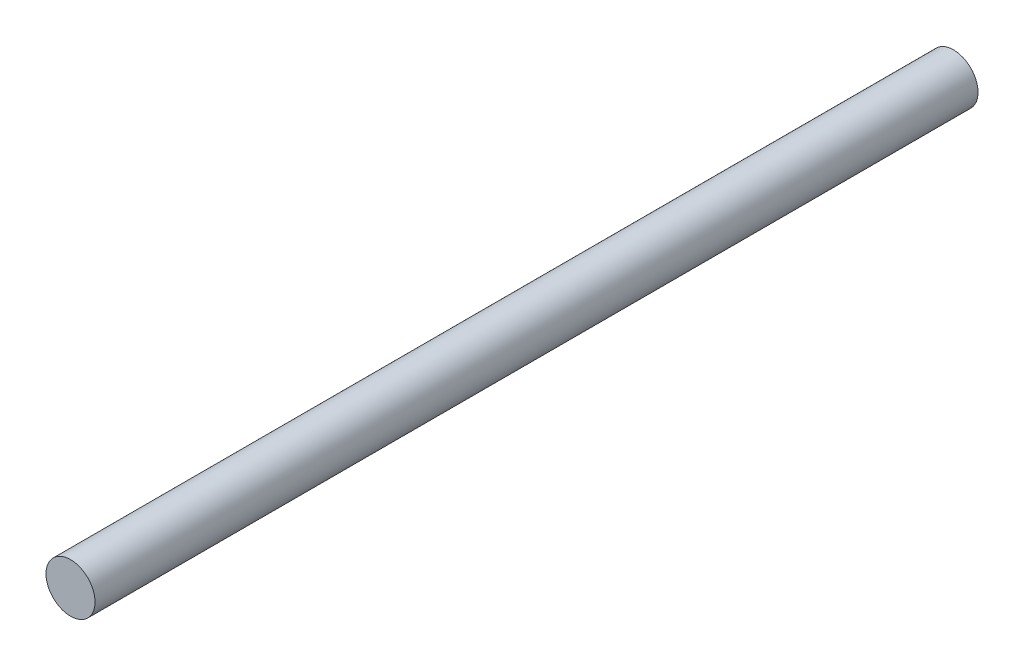
ISO-10303-21;
HEADER;
FILE_DESCRIPTION(('STEP AP214'),'2;1');
FILE_NAME('part.step','',(''),(''),'','','');
FILE_SCHEMA(('AUTOMOTIVE_DESIGN { 1 0 10303 214 1 1 1 1 }'));
ENDSEC;
DATA;
#1=APPLICATION_CONTEXT('core data for automotive mechanical design processes');
#2=APPLICATION_PROTOCOL_DEFINITION('international standard','automotive_design',2000,#1);
#3=PRODUCT_CONTEXT('',#1,'mechanical');
#4=PRODUCT('Part','Part','',(#3));
#5=PRODUCT_RELATED_PRODUCT_CATEGORY('part','',(#4));
#6=PRODUCT_DEFINITION_FORMATION('','',#4);
#7=PRODUCT_DEFINITION_CONTEXT('part definition',#1,'design');
#8=PRODUCT_DEFINITION('design','',#6,#7);
#9=PRODUCT_DEFINITION_SHAPE('','',#8);
#10=(LENGTH_UNIT() NAMED_UNIT(*) SI_UNIT(.MILLI.,.METRE.));
#11=(NAMED_UNIT(*) PLANE_ANGLE_UNIT() SI_UNIT($,.RADIAN.));
#12=(NAMED_UNIT(*) SI_UNIT($,.STERADIAN.) SOLID_ANGLE_UNIT());
#13=UNCERTAINTY_MEASURE_WITH_UNIT(LENGTH_MEASURE(1.E-05),#10,'distance_accuracy_value','');
#14=(GEOMETRIC_REPRESENTATION_CONTEXT(3) GLOBAL_UNCERTAINTY_ASSIGNED_CONTEXT((#13)) GLOBAL_UNIT_ASSIGNED_CONTEXT((#10,
#11,#12)) REPRESENTATION_CONTEXT('',''));
#15=CARTESIAN_POINT('',(0.,0.,0.));
#16=DIRECTION('',(0.,0.,1.));
#17=DIRECTION('',(1.,0.,0.));
#18=AXIS2_PLACEMENT_3D('',#15,#16,#17);
#19=CARTESIAN_POINT('',(0.,0.,180.));
#20=DIRECTION('',(0.,0.,-1.));
#21=DIRECTION('',(-1.,0.,0.));
#22=AXIS2_PLACEMENT_3D('',#19,#20,#21);
#23=CYLINDRICAL_SURFACE('',#22,5.);
#24=CARTESIAN_POINT('',(0.,0.,180.));
#25=DIRECTION('',(0.,0.,1.));
#26=DIRECTION('',(1.,0.,0.));
#27=AXIS2_PLACEMENT_3D('',#24,#25,#26);
#28=CIRCLE('',#27,5.);
#29=CARTESIAN_POINT('',(-5.,0.,180.));
#30=VERTEX_POINT('',#29);
#31=EDGE_CURVE('E10',#30,#30,#28,.T.);
#32=CARTESIAN_POINT('',(0.,0.,0.));
#33=DIRECTION('',(0.,0.,1.));
#34=DIRECTION('',(1.,0.,0.));
#35=AXIS2_PLACEMENT_3D('',#32,#33,#34);
#36=CIRCLE('',#35,5.);
#37=CARTESIAN_POINT('',(-5.,0.,0.));
#38=VERTEX_POINT('',#37);
#39=EDGE_CURVE('E40',#38,#38,#36,.T.);
#40=CARTESIAN_POINT('',(-5.,0.,180.));
#41=CARTESIAN_POINT('',(-5.,0.,178.125));
#42=CARTESIAN_POINT('',(-5.,0.,176.25));
#43=CARTESIAN_POINT('',(-5.,0.,172.5));
#44=CARTESIAN_POINT('',(-5.,0.,170.625));
#45=CARTESIAN_POINT('',(-5.,0.,166.875));
#46=CARTESIAN_POINT('',(-5.,0.,165.));
#47=CARTESIAN_POINT('',(-5.,0.,161.25));
#48=CARTESIAN_POINT('',(-5.,0.,159.375));
#49=CARTESIAN_POINT('',(-5.,0.,155.625));
#50=CARTESIAN_POINT('',(-5.,0.,153.75));
#51=CARTESIAN_POINT('',(-5.,0.,150.));
#52=CARTESIAN_POINT('',(-5.,0.,148.125));
#53=CARTESIAN_POINT('',(-5.,0.,144.375));
#54=CARTESIAN_POINT('',(-5.,0.,142.5));
#55=CARTESIAN_POINT('',(-5.,0.,138.75));
#56=CARTESIAN_POINT('',(-5.,0.,136.875));
#57=CARTESIAN_POINT('',(-5.,0.,133.125));
#58=CARTESIAN_POINT('',(-5.,0.,131.25));
#59=CARTESIAN_POINT('',(-5.,0.,127.5));
#60=CARTESIAN_POINT('',(-5.,0.,125.625));
#61=CARTESIAN_POINT('',(-5.,0.,121.875));
#62=CARTESIAN_POINT('',(-5.,0.,120.));
#63=CARTESIAN_POINT('',(-5.,0.,116.25));
#64=CARTESIAN_POINT('',(-5.,0.,114.375));
#65=CARTESIAN_POINT('',(-5.,0.,110.625));
#66=CARTESIAN_POINT('',(-5.,0.,108.75));
#67=CARTESIAN_POINT('',(-5.,0.,105.));
#68=CARTESIAN_POINT('',(-5.,0.,103.125));
#69=CARTESIAN_POINT('',(-5.,0.,99.375));
#70=CARTESIAN_POINT('',(-5.,0.,97.5));
#71=CARTESIAN_POINT('',(-5.,0.,93.75));
#72=CARTESIAN_POINT('',(-5.,0.,91.875));
#73=CARTESIAN_POINT('',(-5.,0.,88.125));
#74=CARTESIAN_POINT('',(-5.,0.,86.25));
#75=CARTESIAN_POINT('',(-5.,0.,82.5));
#76=CARTESIAN_POINT('',(-5.,0.,80.625));
#77=CARTESIAN_POINT('',(-5.,0.,76.875));
#78=CARTESIAN_POINT('',(-5.,0.,75.));
#79=CARTESIAN_POINT('',(-5.,0.,71.25));
#80=CARTESIAN_POINT('',(-5.,0.,69.375));
#81=CARTESIAN_POINT('',(-5.,0.,65.625));
#82=CARTESIAN_POINT('',(-5.,0.,63.75));
#83=CARTESIAN_POINT('',(-5.,0.,60.));
#84=CARTESIAN_POINT('',(-5.,0.,58.125));
#85=CARTESIAN_POINT('',(-5.,0.,54.375));
#86=CARTESIAN_POINT('',(-5.,0.,52.5));
#87=CARTESIAN_POINT('',(-5.,0.,48.75));
#88=CARTESIAN_POINT('',(-5.,0.,46.875));
#89=CARTESIAN_POINT('',(-5.,0.,43.125));
#90=CARTESIAN_POINT('',(-5.,0.,41.25));
#91=CARTESIAN_POINT('',(-5.,0.,37.5));
#92=CARTESIAN_POINT('',(-5.,0.,35.625));
#93=CARTESIAN_POINT('',(-5.,0.,31.875));
#94=CARTESIAN_POINT('',(-5.,0.,30.));
#95=CARTESIAN_POINT('',(-5.,0.,26.25));
#96=CARTESIAN_POINT('',(-5.,0.,24.375));
#97=CARTESIAN_POINT('',(-5.,0.,20.625));
#98=CARTESIAN_POINT('',(-5.,0.,18.75));
#99=CARTESIAN_POINT('',(-5.,0.,15.));
#100=CARTESIAN_POINT('',(-5.,0.,13.125));
#101=CARTESIAN_POINT('',(-5.,0.,9.37499999999998));
#102=CARTESIAN_POINT('',(-5.,0.,7.49999999999997));
#103=CARTESIAN_POINT('',(-5.,0.,3.74999999999997));
#104=CARTESIAN_POINT('',(-5.,0.,1.87499999999997));
#105=CARTESIAN_POINT('',(-5.,0.,0.));
#106=B_SPLINE_CURVE_WITH_KNOTS('',3,(#40,#41,#42,#43,#44,#45,#46,#47,#48,#49,#50,#51,#52,#53,
#54,#55,#56,#57,#58,#59,#60,#61,#62,#63,#64,#65,#66,#67,#68,#69,#70,#71,#72,#73,#74,#75,#76,#77,
#78,#79,#80,#81,#82,#83,#84,#85,#86,#87,#88,#89,#90,#91,#92,#93,#94,#95,#96,#97,#98,#99,#100,
#101,#102,#103,#104,#105),.UNSPECIFIED.,.F.,.F.,(4,2,2,2,2,2,2,2,2,2,2,2,2,2,2,2,2,2,2,2,2,2,2,
2,2,2,2,2,2,2,2,2,4),(0.,5.62500000000002,11.25,16.875,22.5,28.125,33.75,39.375,45.,50.625,
56.25,61.875,67.5,73.125,78.75,84.375,90.,95.625,101.25,106.875,112.5,118.125,123.75,129.375,
135.,140.625,146.25,151.875,157.5,163.125,168.75,174.375,180.),.UNSPECIFIED.);
#107=EDGE_CURVE('BSEAM37',#30,#38,#106,.T.);
#108=ORIENTED_EDGE('',*,*,#31,.F.);
#109=ORIENTED_EDGE('',*,*,#39,.T.);
#110=ORIENTED_EDGE('',*,*,#107,.T.);
#111=ORIENTED_EDGE('',*,*,#107,.F.);
#112=EDGE_LOOP('',(#108,#110,#109,#111));
#113=FACE_BOUND('',#112,.T.);
#114=ADVANCED_FACE('F37',(#113),#23,.T.);
#115=CARTESIAN_POINT('',(0.,0.,180.));
#116=DIRECTION('',(0.,0.,1.));
#117=DIRECTION('',(1.,0.,0.));
#118=AXIS2_PLACEMENT_3D('',#115,#116,#117);
#119=PLANE('',#118);
#120=ORIENTED_EDGE('',*,*,#31,.T.);
#121=EDGE_LOOP('',(#120));
#122=FACE_BOUND('',#121,.T.);
#123=ADVANCED_FACE('F54',(#122),#119,.T.);
#124=CARTESIAN_POINT('',(0.,0.,0.));
#125=DIRECTION('',(0.,0.,1.));
#126=DIRECTION('',(1.,0.,0.));
#127=AXIS2_PLACEMENT_3D('',#124,#125,#126);
#128=PLANE('',#127);
#129=ORIENTED_EDGE('',*,*,#39,.F.);
#130=EDGE_LOOP('',(#129));
#131=FACE_BOUND('',#130,.T.);
#132=ADVANCED_FACE('F52',(#131),#128,.F.);
#133=CLOSED_SHELL('',(#114,#123,#132));
#134=MANIFOLD_SOLID_BREP('B2',#133);
#135=ADVANCED_BREP_SHAPE_REPRESENTATION('',(#18,#134),#14);
#136=SHAPE_DEFINITION_REPRESENTATION(#9,#135);
ENDSEC;
END-ISO-10303-21;
